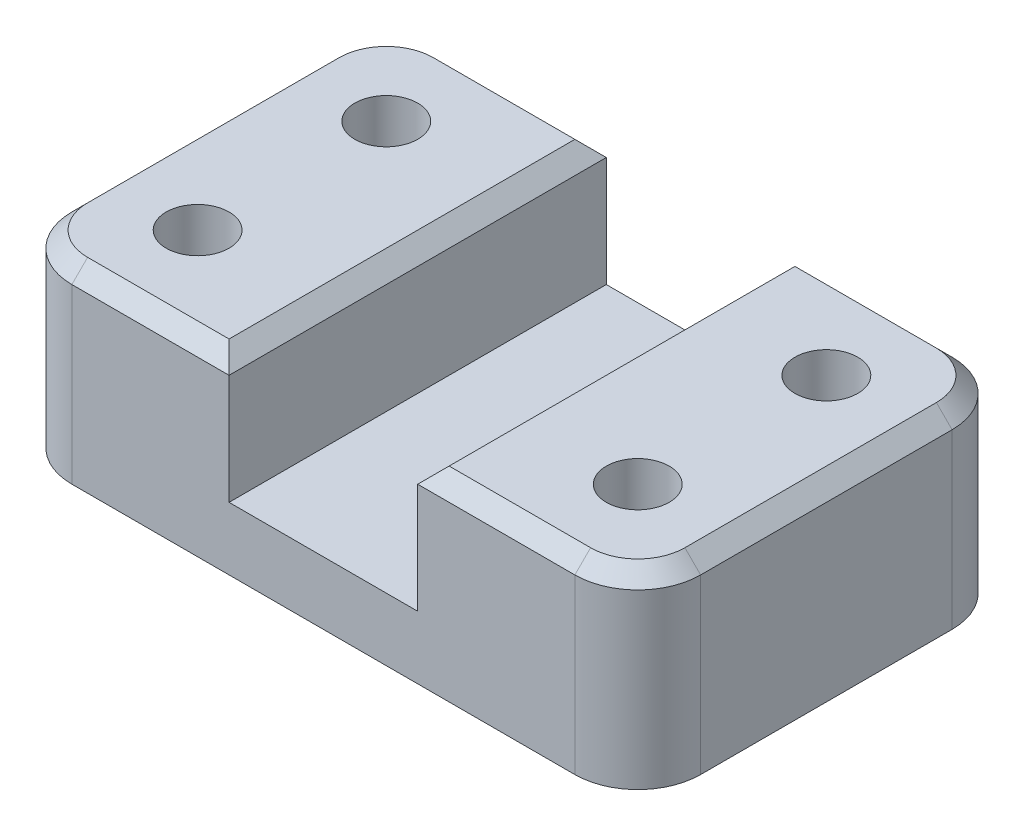
ISO-10303-21;
HEADER;
FILE_DESCRIPTION(('STEP AP214'),'2;1');
FILE_NAME('part.step','',(''),(''),'','','');
FILE_SCHEMA(('AUTOMOTIVE_DESIGN { 1 0 10303 214 1 1 1 1 }'));
ENDSEC;
DATA;
#1=APPLICATION_CONTEXT('core data for automotive mechanical design processes');
#2=APPLICATION_PROTOCOL_DEFINITION('international standard','automotive_design',2000,#1);
#3=PRODUCT_CONTEXT('',#1,'mechanical');
#4=PRODUCT('Part','Part','',(#3));
#5=PRODUCT_RELATED_PRODUCT_CATEGORY('part','',(#4));
#6=PRODUCT_DEFINITION_FORMATION('','',#4);
#7=PRODUCT_DEFINITION_CONTEXT('part definition',#1,'design');
#8=PRODUCT_DEFINITION('design','',#6,#7);
#9=PRODUCT_DEFINITION_SHAPE('','',#8);
#10=(LENGTH_UNIT() NAMED_UNIT(*) SI_UNIT(.MILLI.,.METRE.));
#11=(NAMED_UNIT(*) PLANE_ANGLE_UNIT() SI_UNIT($,.RADIAN.));
#12=(NAMED_UNIT(*) SI_UNIT($,.STERADIAN.) SOLID_ANGLE_UNIT());
#13=UNCERTAINTY_MEASURE_WITH_UNIT(LENGTH_MEASURE(1.E-05),#10,'distance_accuracy_value','');
#14=(GEOMETRIC_REPRESENTATION_CONTEXT(3) GLOBAL_UNCERTAINTY_ASSIGNED_CONTEXT((#13)) GLOBAL_UNIT_ASSIGNED_CONTEXT((#10,
#11,#12)) REPRESENTATION_CONTEXT('',''));
#15=CARTESIAN_POINT('',(0.,0.,0.));
#16=DIRECTION('',(0.,0.,1.));
#17=DIRECTION('',(1.,0.,0.));
#18=AXIS2_PLACEMENT_3D('',#15,#16,#17);
#19=CARTESIAN_POINT('',(0.,1500.,0.));
#20=DIRECTION('',(0.,-1.,0.));
#21=DIRECTION('',(0.,0.,-1.));
#22=AXIS2_PLACEMENT_3D('',#19,#20,#21);
#23=PLANE('',#22);
#24=DIRECTION('',(0.,0.,-1.));
#25=VECTOR('',#24,1.);
#26=CARTESIAN_POINT('',(-874.999999999999,1500.,0.));
#27=LINE('',#26,#25);
#28=CARTESIAN_POINT('',(-874.999999999999,1500.,1375.));
#29=VERTEX_POINT('',#28);
#30=CARTESIAN_POINT('',(-874.999999999999,1500.,-1375.));
#31=VERTEX_POINT('',#30);
#32=EDGE_CURVE('E345',#29,#31,#27,.T.);
#33=ORIENTED_EDGE('',*,*,#32,.T.);
#34=DIRECTION('',(-1.,0.,0.));
#35=VECTOR('',#34,1.);
#36=CARTESIAN_POINT('',(0.,1500.,-1375.));
#37=LINE('',#36,#35);
#38=CARTESIAN_POINT('',(-2000.,1500.,-1375.));
#39=VERTEX_POINT('',#38);
#40=EDGE_CURVE('E357',#31,#39,#37,.T.);
#41=ORIENTED_EDGE('',*,*,#40,.T.);
#42=CARTESIAN_POINT('',(-2000.,1500.,-1000.));
#43=DIRECTION('',(0.,-1.,0.));
#44=DIRECTION('',(0.,0.,-1.));
#45=AXIS2_PLACEMENT_3D('',#42,#43,#44);
#46=CIRCLE('',#45,375.000000000001);
#47=CARTESIAN_POINT('',(-2375.,1500.,-1000.));
#48=VERTEX_POINT('',#47);
#49=EDGE_CURVE('E354',#39,#48,#46,.F.);
#50=ORIENTED_EDGE('',*,*,#49,.T.);
#51=DIRECTION('',(0.,0.,1.));
#52=VECTOR('',#51,1.);
#53=CARTESIAN_POINT('',(-2375.,1500.,0.));
#54=LINE('',#53,#52);
#55=CARTESIAN_POINT('',(-2375.,1500.,1000.));
#56=VERTEX_POINT('',#55);
#57=EDGE_CURVE('E351',#48,#56,#54,.T.);
#58=ORIENTED_EDGE('',*,*,#57,.T.);
#59=CARTESIAN_POINT('',(-2000.,1500.,1000.));
#60=DIRECTION('',(0.,-1.,0.));
#61=DIRECTION('',(0.,0.,-1.));
#62=AXIS2_PLACEMENT_3D('',#59,#60,#61);
#63=CIRCLE('',#62,375.000000000001);
#64=CARTESIAN_POINT('',(-2000.,1500.,1375.));
#65=VERTEX_POINT('',#64);
#66=EDGE_CURVE('E348',#56,#65,#63,.F.);
#67=ORIENTED_EDGE('',*,*,#66,.T.);
#68=DIRECTION('',(1.,0.,0.));
#69=VECTOR('',#68,1.);
#70=CARTESIAN_POINT('',(0.,1500.,1375.));
#71=LINE('',#70,#69);
#72=EDGE_CURVE('E342',#65,#29,#71,.T.);
#73=ORIENTED_EDGE('',*,*,#72,.T.);
#74=EDGE_LOOP('',(#33,#41,#50,#58,#67,#73));
#75=FACE_BOUND('',#74,.T.);
#76=CARTESIAN_POINT('',(-1750.,1500.,750.));
#77=DIRECTION('',(0.,1.,0.));
#78=DIRECTION('',(0.,0.,-1.));
#79=AXIS2_PLACEMENT_3D('',#76,#77,#78);
#80=CIRCLE('',#79,250.);
#81=CARTESIAN_POINT('',(-1750.,1500.,500.));
#82=VERTEX_POINT('',#81);
#83=EDGE_CURVE('E212',#82,#82,#80,.T.);
#84=ORIENTED_EDGE('',*,*,#83,.F.);
#85=EDGE_LOOP('',(#84));
#86=FACE_BOUND('',#85,.T.);
#87=CARTESIAN_POINT('',(-1750.,1500.,-750.));
#88=DIRECTION('',(0.,1.,0.));
#89=DIRECTION('',(0.,0.,1.));
#90=AXIS2_PLACEMENT_3D('',#87,#88,#89);
#91=CIRCLE('',#90,250.);
#92=CARTESIAN_POINT('',(-1750.,1500.,-500.));
#93=VERTEX_POINT('',#92);
#94=EDGE_CURVE('E237',#93,#93,#91,.T.);
#95=ORIENTED_EDGE('',*,*,#94,.F.);
#96=EDGE_LOOP('',(#95));
#97=FACE_BOUND('',#96,.T.);
#98=ADVANCED_FACE('F46',(#75,#86,#97),#23,.F.);
#99=CARTESIAN_POINT('',(2000.,1500.,-1000.));
#100=DIRECTION('',(0.,-1.,0.));
#101=DIRECTION('',(0.,0.,-1.));
#102=AXIS2_PLACEMENT_3D('',#99,#100,#101);
#103=CIRCLE('',#102,375.000000000001);
#104=CARTESIAN_POINT('',(2375.,1500.,-1000.));
#105=VERTEX_POINT('',#104);
#106=CARTESIAN_POINT('',(2000.,1500.,-1375.));
#107=VERTEX_POINT('',#106);
#108=EDGE_CURVE('E310',#105,#107,#103,.F.);
#109=ORIENTED_EDGE('',*,*,#108,.T.);
#110=DIRECTION('',(-1.,0.,0.));
#111=VECTOR('',#110,1.);
#112=CARTESIAN_POINT('',(0.,1500.,-1375.));
#113=LINE('',#112,#111);
#114=CARTESIAN_POINT('',(874.999999999999,1500.,-1375.));
#115=VERTEX_POINT('',#114);
#116=EDGE_CURVE('E313',#107,#115,#113,.T.);
#117=ORIENTED_EDGE('',*,*,#116,.T.);
#118=DIRECTION('',(0.,0.,1.));
#119=VECTOR('',#118,1.);
#120=CARTESIAN_POINT('',(874.999999999999,1500.,0.));
#121=LINE('',#120,#119);
#122=CARTESIAN_POINT('',(874.999999999999,1500.,1375.));
#123=VERTEX_POINT('',#122);
#124=EDGE_CURVE('E301',#115,#123,#121,.T.);
#125=ORIENTED_EDGE('',*,*,#124,.T.);
#126=DIRECTION('',(1.,0.,0.));
#127=VECTOR('',#126,1.);
#128=CARTESIAN_POINT('',(0.,1500.,1375.));
#129=LINE('',#128,#127);
#130=CARTESIAN_POINT('',(2000.,1500.,1375.));
#131=VERTEX_POINT('',#130);
#132=EDGE_CURVE('E298',#123,#131,#129,.T.);
#133=ORIENTED_EDGE('',*,*,#132,.T.);
#134=CARTESIAN_POINT('',(2000.,1500.,1000.));
#135=DIRECTION('',(0.,-1.,0.));
#136=DIRECTION('',(0.,0.,-1.));
#137=AXIS2_PLACEMENT_3D('',#134,#135,#136);
#138=CIRCLE('',#137,375.000000000001);
#139=CARTESIAN_POINT('',(2375.,1500.,1000.));
#140=VERTEX_POINT('',#139);
#141=EDGE_CURVE('E304',#131,#140,#138,.F.);
#142=ORIENTED_EDGE('',*,*,#141,.T.);
#143=DIRECTION('',(0.,0.,-1.));
#144=VECTOR('',#143,1.);
#145=CARTESIAN_POINT('',(2375.,1500.,0.));
#146=LINE('',#145,#144);
#147=EDGE_CURVE('E307',#140,#105,#146,.T.);
#148=ORIENTED_EDGE('',*,*,#147,.T.);
#149=EDGE_LOOP('',(#109,#117,#125,#133,#142,#148));
#150=FACE_BOUND('',#149,.T.);
#151=CARTESIAN_POINT('',(1750.,1500.,-749.999999999995));
#152=DIRECTION('',(0.,1.,0.));
#153=DIRECTION('',(0.,0.,-1.));
#154=AXIS2_PLACEMENT_3D('',#151,#152,#153);
#155=CIRCLE('',#154,250.);
#156=CARTESIAN_POINT('',(1750.,1500.,-999.999999999996));
#157=VERTEX_POINT('',#156);
#158=EDGE_CURVE('E229',#157,#157,#155,.T.);
#159=ORIENTED_EDGE('',*,*,#158,.F.);
#160=EDGE_LOOP('',(#159));
#161=FACE_BOUND('',#160,.T.);
#162=CARTESIAN_POINT('',(1750.,1500.,749.999999999995));
#163=DIRECTION('',(0.,1.,0.));
#164=DIRECTION('',(0.,0.,1.));
#165=AXIS2_PLACEMENT_3D('',#162,#163,#164);
#166=CIRCLE('',#165,250.);
#167=CARTESIAN_POINT('',(1750.,1500.,999.999999999996));
#168=VERTEX_POINT('',#167);
#169=EDGE_CURVE('E221',#168,#168,#166,.T.);
#170=ORIENTED_EDGE('',*,*,#169,.F.);
#171=EDGE_LOOP('',(#170));
#172=FACE_BOUND('',#171,.T.);
#173=ADVANCED_FACE('F472',(#150,#161,#172),#23,.F.);
#174=CARTESIAN_POINT('',(0.,0.,0.));
#175=DIRECTION('',(0.,-1.,0.));
#176=DIRECTION('',(0.,0.,-1.));
#177=AXIS2_PLACEMENT_3D('',#174,#175,#176);
#178=PLANE('',#177);
#179=CARTESIAN_POINT('',(1750.,0.,749.999999999995));
#180=DIRECTION('',(0.,1.,0.));
#181=DIRECTION('',(0.,0.,1.));
#182=AXIS2_PLACEMENT_3D('',#179,#180,#181);
#183=CIRCLE('',#182,250.);
#184=CARTESIAN_POINT('',(1750.,0.,999.999999999996));
#185=VERTEX_POINT('',#184);
#186=EDGE_CURVE('E216',#185,#185,#183,.T.);
#187=ORIENTED_EDGE('',*,*,#186,.T.);
#188=EDGE_LOOP('',(#187));
#189=FACE_BOUND('',#188,.T.);
#190=CARTESIAN_POINT('',(-1750.,0.,-750.));
#191=DIRECTION('',(0.,1.,0.));
#192=DIRECTION('',(0.,0.,1.));
#193=AXIS2_PLACEMENT_3D('',#190,#191,#192);
#194=CIRCLE('',#193,250.);
#195=CARTESIAN_POINT('',(-1750.,0.,-500.));
#196=VERTEX_POINT('',#195);
#197=EDGE_CURVE('E233',#196,#196,#194,.T.);
#198=ORIENTED_EDGE('',*,*,#197,.T.);
#199=EDGE_LOOP('',(#198));
#200=FACE_BOUND('',#199,.T.);
#201=DIRECTION('',(0.,0.,1.));
#202=VECTOR('',#201,1.);
#203=CARTESIAN_POINT('',(-2500.,0.,1500.));
#204=LINE('',#203,#202);
#205=CARTESIAN_POINT('',(-2500.,0.,-1000.));
#206=VERTEX_POINT('',#205);
#207=CARTESIAN_POINT('',(-2500.,0.,1000.));
#208=VERTEX_POINT('',#207);
#209=EDGE_CURVE('E252',#206,#208,#204,.T.);
#210=ORIENTED_EDGE('',*,*,#209,.F.);
#211=CARTESIAN_POINT('',(-2000.,0.,-1000.));
#212=DIRECTION('',(0.,-1.,0.));
#213=DIRECTION('',(0.,0.,-1.));
#214=AXIS2_PLACEMENT_3D('',#211,#212,#213);
#215=CIRCLE('',#214,500.);
#216=CARTESIAN_POINT('',(-2000.,0.,-1500.));
#217=VERTEX_POINT('',#216);
#218=EDGE_CURVE('E275',#206,#217,#215,.T.);
#219=ORIENTED_EDGE('',*,*,#218,.T.);
#220=DIRECTION('',(-1.,0.,0.));
#221=VECTOR('',#220,1.);
#222=CARTESIAN_POINT('',(-2500.,0.,-1500.));
#223=LINE('',#222,#221);
#224=CARTESIAN_POINT('',(2000.,0.,-1500.));
#225=VERTEX_POINT('',#224);
#226=EDGE_CURVE('E248',#225,#217,#223,.T.);
#227=ORIENTED_EDGE('',*,*,#226,.F.);
#228=CARTESIAN_POINT('',(2000.,0.,-1000.));
#229=DIRECTION('',(0.,-1.,0.));
#230=DIRECTION('',(0.,0.,-1.));
#231=AXIS2_PLACEMENT_3D('',#228,#229,#230);
#232=CIRCLE('',#231,500.);
#233=CARTESIAN_POINT('',(2500.,0.,-1000.));
#234=VERTEX_POINT('',#233);
#235=EDGE_CURVE('E269',#225,#234,#232,.T.);
#236=ORIENTED_EDGE('',*,*,#235,.T.);
#237=DIRECTION('',(0.,0.,-1.));
#238=VECTOR('',#237,1.);
#239=CARTESIAN_POINT('',(2500.,0.,1500.));
#240=LINE('',#239,#238);
#241=CARTESIAN_POINT('',(2500.,0.,1000.));
#242=VERTEX_POINT('',#241);
#243=EDGE_CURVE('E241',#242,#234,#240,.T.);
#244=ORIENTED_EDGE('',*,*,#243,.F.);
#245=CARTESIAN_POINT('',(2000.,0.,1000.));
#246=DIRECTION('',(0.,-1.,0.));
#247=DIRECTION('',(0.,0.,-1.));
#248=AXIS2_PLACEMENT_3D('',#245,#246,#247);
#249=CIRCLE('',#248,500.);
#250=CARTESIAN_POINT('',(2000.,0.,1500.));
#251=VERTEX_POINT('',#250);
#252=EDGE_CURVE('E266',#242,#251,#249,.T.);
#253=ORIENTED_EDGE('',*,*,#252,.T.);
#254=DIRECTION('',(1.,0.,0.));
#255=VECTOR('',#254,1.);
#256=CARTESIAN_POINT('',(-2500.,0.,1500.));
#257=LINE('',#256,#255);
#258=CARTESIAN_POINT('',(-2000.,0.,1500.));
#259=VERTEX_POINT('',#258);
#260=EDGE_CURVE('E256',#259,#251,#257,.T.);
#261=ORIENTED_EDGE('',*,*,#260,.F.);
#262=CARTESIAN_POINT('',(-2000.,0.,1000.));
#263=DIRECTION('',(0.,-1.,0.));
#264=DIRECTION('',(0.,0.,-1.));
#265=AXIS2_PLACEMENT_3D('',#262,#263,#264);
#266=CIRCLE('',#265,500.);
#267=EDGE_CURVE('E272',#259,#208,#266,.T.);
#268=ORIENTED_EDGE('',*,*,#267,.T.);
#269=EDGE_LOOP('',(#210,#219,#227,#236,#244,#253,#261,#268));
#270=FACE_BOUND('',#269,.T.);
#271=CARTESIAN_POINT('',(1750.,0.,-749.999999999995));
#272=DIRECTION('',(0.,1.,0.));
#273=DIRECTION('',(0.,0.,-1.));
#274=AXIS2_PLACEMENT_3D('',#271,#272,#273);
#275=CIRCLE('',#274,250.);
#276=CARTESIAN_POINT('',(1750.,0.,-999.999999999996));
#277=VERTEX_POINT('',#276);
#278=EDGE_CURVE('E225',#277,#277,#275,.T.);
#279=ORIENTED_EDGE('',*,*,#278,.T.);
#280=EDGE_LOOP('',(#279));
#281=FACE_BOUND('',#280,.T.);
#282=CARTESIAN_POINT('',(-1750.,0.,750.));
#283=DIRECTION('',(0.,1.,0.));
#284=DIRECTION('',(0.,0.,-1.));
#285=AXIS2_PLACEMENT_3D('',#282,#283,#284);
#286=CIRCLE('',#285,250.);
#287=CARTESIAN_POINT('',(-1750.,0.,500.));
#288=VERTEX_POINT('',#287);
#289=EDGE_CURVE('E217',#288,#288,#286,.T.);
#290=ORIENTED_EDGE('',*,*,#289,.T.);
#291=EDGE_LOOP('',(#290));
#292=FACE_BOUND('',#291,.T.);
#293=ADVANCED_FACE('F451',(#189,#200,#270,#281,#292),#178,.T.);
#294=CARTESIAN_POINT('',(2500.,1500.,1500.));
#295=DIRECTION('',(-1.,0.,0.));
#296=DIRECTION('',(0.,0.,1.));
#297=AXIS2_PLACEMENT_3D('',#294,#295,#296);
#298=PLANE('',#297);
#299=DIRECTION('',(0.,-1.,0.));
#300=VECTOR('',#299,1.);
#301=CARTESIAN_POINT('',(2500.,1500.,-1000.));
#302=LINE('',#301,#300);
#303=CARTESIAN_POINT('',(2500.,1375.,-1000.));
#304=VERTEX_POINT('',#303);
#305=EDGE_CURVE('E294',#234,#304,#302,.F.);
#306=ORIENTED_EDGE('',*,*,#305,.T.);
#307=DIRECTION('',(0.,0.,1.));
#308=VECTOR('',#307,1.);
#309=CARTESIAN_POINT('',(2500.,1375.,1500.));
#310=LINE('',#309,#308);
#311=CARTESIAN_POINT('',(2500.,1375.,1000.));
#312=VERTEX_POINT('',#311);
#313=EDGE_CURVE('E328',#304,#312,#310,.T.);
#314=ORIENTED_EDGE('',*,*,#313,.T.);
#315=DIRECTION('',(0.,-1.,0.));
#316=VECTOR('',#315,1.);
#317=CARTESIAN_POINT('',(2500.,1500.,1000.));
#318=LINE('',#317,#316);
#319=EDGE_CURVE('E291',#312,#242,#318,.T.);
#320=ORIENTED_EDGE('',*,*,#319,.T.);
#321=ORIENTED_EDGE('',*,*,#243,.T.);
#322=EDGE_LOOP('',(#306,#314,#320,#321));
#323=FACE_BOUND('',#322,.T.);
#324=ADVANCED_FACE('F496',(#323),#298,.F.);
#325=CARTESIAN_POINT('',(-2500.,1500.,-1500.));
#326=DIRECTION('',(0.,0.,1.));
#327=DIRECTION('',(1.,0.,0.));
#328=AXIS2_PLACEMENT_3D('',#325,#326,#327);
#329=PLANE('',#328);
#330=DIRECTION('',(0.,1.,0.));
#331=VECTOR('',#330,1.);
#332=CARTESIAN_POINT('',(750.,500.,-1500.));
#333=LINE('',#332,#331);
#334=CARTESIAN_POINT('',(750.,500.,-1500.));
#335=VERTEX_POINT('',#334);
#336=CARTESIAN_POINT('',(750.,1375.,-1500.));
#337=VERTEX_POINT('',#336);
#338=EDGE_CURVE('E182',#335,#337,#333,.T.);
#339=ORIENTED_EDGE('',*,*,#338,.T.);
#340=DIRECTION('',(1.,0.,0.));
#341=VECTOR('',#340,1.);
#342=CARTESIAN_POINT('',(-2500.,1375.,-1500.));
#343=LINE('',#342,#341);
#344=CARTESIAN_POINT('',(2000.,1375.,-1500.));
#345=VERTEX_POINT('',#344);
#346=EDGE_CURVE('E321',#337,#345,#343,.T.);
#347=ORIENTED_EDGE('',*,*,#346,.T.);
#348=DIRECTION('',(0.,-1.,0.));
#349=VECTOR('',#348,1.);
#350=CARTESIAN_POINT('',(2000.,1500.,-1500.));
#351=LINE('',#350,#349);
#352=EDGE_CURVE('E278',#345,#225,#351,.T.);
#353=ORIENTED_EDGE('',*,*,#352,.T.);
#354=ORIENTED_EDGE('',*,*,#226,.T.);
#355=DIRECTION('',(0.,-1.,0.));
#356=VECTOR('',#355,1.);
#357=CARTESIAN_POINT('',(-2000.,1500.,-1500.));
#358=LINE('',#357,#356);
#359=CARTESIAN_POINT('',(-2000.,1375.,-1500.));
#360=VERTEX_POINT('',#359);
#361=EDGE_CURVE('E281',#217,#360,#358,.F.);
#362=ORIENTED_EDGE('',*,*,#361,.T.);
#363=DIRECTION('',(1.,0.,0.));
#364=VECTOR('',#363,1.);
#365=CARTESIAN_POINT('',(-2500.,1375.,-1500.));
#366=LINE('',#365,#364);
#367=CARTESIAN_POINT('',(-750.,1375.,-1500.));
#368=VERTEX_POINT('',#367);
#369=EDGE_CURVE('E317',#360,#368,#366,.T.);
#370=ORIENTED_EDGE('',*,*,#369,.T.);
#371=DIRECTION('',(0.,1.,0.));
#372=VECTOR('',#371,1.);
#373=CARTESIAN_POINT('',(-750.,500.,-1500.));
#374=LINE('',#373,#372);
#375=CARTESIAN_POINT('',(-750.,500.,-1500.));
#376=VERTEX_POINT('',#375);
#377=EDGE_CURVE('E207',#376,#368,#374,.T.);
#378=ORIENTED_EDGE('',*,*,#377,.F.);
#379=DIRECTION('',(-1.,0.,0.));
#380=VECTOR('',#379,1.);
#381=CARTESIAN_POINT('',(750.,500.,-1500.));
#382=LINE('',#381,#380);
#383=EDGE_CURVE('E187',#335,#376,#382,.T.);
#384=ORIENTED_EDGE('',*,*,#383,.F.);
#385=EDGE_LOOP('',(#339,#347,#353,#354,#362,#370,#378,#384));
#386=FACE_BOUND('',#385,.T.);
#387=ADVANCED_FACE('F432',(#386),#329,.F.);
#388=CARTESIAN_POINT('',(-2500.,1500.,1500.));
#389=DIRECTION('',(1.,0.,0.));
#390=DIRECTION('',(0.,0.,-1.));
#391=AXIS2_PLACEMENT_3D('',#388,#389,#390);
#392=PLANE('',#391);
#393=DIRECTION('',(0.,-1.,0.));
#394=VECTOR('',#393,1.);
#395=CARTESIAN_POINT('',(-2500.,1500.,1000.));
#396=LINE('',#395,#394);
#397=CARTESIAN_POINT('',(-2500.,1375.,1000.));
#398=VERTEX_POINT('',#397);
#399=EDGE_CURVE('E260',#208,#398,#396,.F.);
#400=ORIENTED_EDGE('',*,*,#399,.T.);
#401=DIRECTION('',(0.,0.,-1.));
#402=VECTOR('',#401,1.);
#403=CARTESIAN_POINT('',(-2500.,1375.,1500.));
#404=LINE('',#403,#402);
#405=CARTESIAN_POINT('',(-2500.,1375.,-1000.));
#406=VERTEX_POINT('',#405);
#407=EDGE_CURVE('E71',#398,#406,#404,.T.);
#408=ORIENTED_EDGE('',*,*,#407,.T.);
#409=DIRECTION('',(0.,-1.,0.));
#410=VECTOR('',#409,1.);
#411=CARTESIAN_POINT('',(-2500.,1500.,-1000.));
#412=LINE('',#411,#410);
#413=EDGE_CURVE('E263',#406,#206,#412,.T.);
#414=ORIENTED_EDGE('',*,*,#413,.T.);
#415=ORIENTED_EDGE('',*,*,#209,.T.);
#416=EDGE_LOOP('',(#400,#408,#414,#415));
#417=FACE_BOUND('',#416,.T.);
#418=ADVANCED_FACE('F497',(#417),#392,.F.);
#419=CARTESIAN_POINT('',(-2500.,1500.,1500.));
#420=DIRECTION('',(0.,0.,-1.));
#421=DIRECTION('',(-1.,0.,0.));
#422=AXIS2_PLACEMENT_3D('',#419,#420,#421);
#423=PLANE('',#422);
#424=DIRECTION('',(0.,-1.,0.));
#425=VECTOR('',#424,1.);
#426=CARTESIAN_POINT('',(2000.,1500.,1500.));
#427=LINE('',#426,#425);
#428=CARTESIAN_POINT('',(2000.,1375.,1500.));
#429=VERTEX_POINT('',#428);
#430=EDGE_CURVE('E285',#251,#429,#427,.F.);
#431=ORIENTED_EDGE('',*,*,#430,.T.);
#432=DIRECTION('',(-1.,0.,0.));
#433=VECTOR('',#432,1.);
#434=CARTESIAN_POINT('',(-2500.,1375.,1500.));
#435=LINE('',#434,#433);
#436=CARTESIAN_POINT('',(750.,1375.,1500.));
#437=VERTEX_POINT('',#436);
#438=EDGE_CURVE('E201',#429,#437,#435,.T.);
#439=ORIENTED_EDGE('',*,*,#438,.T.);
#440=DIRECTION('',(0.,1.,0.));
#441=VECTOR('',#440,1.);
#442=CARTESIAN_POINT('',(750.,500.,1500.));
#443=LINE('',#442,#441);
#444=CARTESIAN_POINT('',(750.,500.,1500.));
#445=VERTEX_POINT('',#444);
#446=EDGE_CURVE('E179',#445,#437,#443,.T.);
#447=ORIENTED_EDGE('',*,*,#446,.F.);
#448=DIRECTION('',(1.,0.,0.));
#449=VECTOR('',#448,1.);
#450=CARTESIAN_POINT('',(750.,500.,1500.));
#451=LINE('',#450,#449);
#452=CARTESIAN_POINT('',(-750.,500.,1500.));
#453=VERTEX_POINT('',#452);
#454=EDGE_CURVE('E188',#453,#445,#451,.T.);
#455=ORIENTED_EDGE('',*,*,#454,.F.);
#456=DIRECTION('',(0.,1.,0.));
#457=VECTOR('',#456,1.);
#458=CARTESIAN_POINT('',(-750.,500.,1500.));
#459=LINE('',#458,#457);
#460=CARTESIAN_POINT('',(-750.,1375.,1500.));
#461=VERTEX_POINT('',#460);
#462=EDGE_CURVE('E203',#453,#461,#459,.T.);
#463=ORIENTED_EDGE('',*,*,#462,.T.);
#464=DIRECTION('',(-1.,0.,0.));
#465=VECTOR('',#464,1.);
#466=CARTESIAN_POINT('',(-2500.,1375.,1500.));
#467=LINE('',#466,#465);
#468=CARTESIAN_POINT('',(-2000.,1375.,1500.));
#469=VERTEX_POINT('',#468);
#470=EDGE_CURVE('E337',#461,#469,#467,.T.);
#471=ORIENTED_EDGE('',*,*,#470,.T.);
#472=DIRECTION('',(0.,-1.,0.));
#473=VECTOR('',#472,1.);
#474=CARTESIAN_POINT('',(-2000.,1500.,1500.));
#475=LINE('',#474,#473);
#476=EDGE_CURVE('E288',#469,#259,#475,.T.);
#477=ORIENTED_EDGE('',*,*,#476,.T.);
#478=ORIENTED_EDGE('',*,*,#260,.T.);
#479=EDGE_LOOP('',(#431,#439,#447,#455,#463,#471,#477,#478));
#480=FACE_BOUND('',#479,.T.);
#481=ADVANCED_FACE('F199',(#480),#423,.F.);
#482=CARTESIAN_POINT('',(-1750.,1500.,-750.));
#483=DIRECTION('',(0.,-1.,0.));
#484=DIRECTION('',(0.,0.,-1.));
#485=AXIS2_PLACEMENT_3D('',#482,#483,#484);
#486=CYLINDRICAL_SURFACE('',#485,250.);
#487=ORIENTED_EDGE('',*,*,#94,.T.);
#488=EDGE_LOOP('',(#487));
#489=FACE_BOUND('',#488,.T.);
#490=ORIENTED_EDGE('',*,*,#197,.F.);
#491=EDGE_LOOP('',(#490));
#492=FACE_BOUND('',#491,.T.);
#493=ADVANCED_FACE('F504',(#489,#492),#486,.F.);
#494=CARTESIAN_POINT('',(1750.,1500.,-749.999999999995));
#495=DIRECTION('',(0.,-1.,0.));
#496=DIRECTION('',(0.,0.,-1.));
#497=AXIS2_PLACEMENT_3D('',#494,#495,#496);
#498=CYLINDRICAL_SURFACE('',#497,250.);
#499=ORIENTED_EDGE('',*,*,#158,.T.);
#500=EDGE_LOOP('',(#499));
#501=FACE_BOUND('',#500,.T.);
#502=ORIENTED_EDGE('',*,*,#278,.F.);
#503=EDGE_LOOP('',(#502));
#504=FACE_BOUND('',#503,.T.);
#505=ADVANCED_FACE('F528',(#501,#504),#498,.F.);
#506=CARTESIAN_POINT('',(1750.,1500.,749.999999999995));
#507=DIRECTION('',(0.,-1.,0.));
#508=DIRECTION('',(0.,0.,-1.));
#509=AXIS2_PLACEMENT_3D('',#506,#507,#508);
#510=CYLINDRICAL_SURFACE('',#509,250.);
#511=ORIENTED_EDGE('',*,*,#169,.T.);
#512=EDGE_LOOP('',(#511));
#513=FACE_BOUND('',#512,.T.);
#514=ORIENTED_EDGE('',*,*,#186,.F.);
#515=EDGE_LOOP('',(#514));
#516=FACE_BOUND('',#515,.T.);
#517=ADVANCED_FACE('F533',(#513,#516),#510,.F.);
#518=CARTESIAN_POINT('',(-1750.,1500.,750.));
#519=DIRECTION('',(0.,-1.,0.));
#520=DIRECTION('',(0.,0.,-1.));
#521=AXIS2_PLACEMENT_3D('',#518,#519,#520);
#522=CYLINDRICAL_SURFACE('',#521,250.);
#523=ORIENTED_EDGE('',*,*,#83,.T.);
#524=EDGE_LOOP('',(#523));
#525=FACE_BOUND('',#524,.T.);
#526=ORIENTED_EDGE('',*,*,#289,.F.);
#527=EDGE_LOOP('',(#526));
#528=FACE_BOUND('',#527,.T.);
#529=ADVANCED_FACE('F540',(#525,#528),#522,.F.);
#530=CARTESIAN_POINT('',(-750.,500.,1500.));
#531=DIRECTION('',(-1.,0.,0.));
#532=DIRECTION('',(0.,0.,1.));
#533=AXIS2_PLACEMENT_3D('',#530,#531,#532);
#534=PLANE('',#533);
#535=ORIENTED_EDGE('',*,*,#377,.T.);
#536=DIRECTION('',(0.,0.,1.));
#537=VECTOR('',#536,1.);
#538=CARTESIAN_POINT('',(-750.,1375.,1500.));
#539=LINE('',#538,#537);
#540=EDGE_CURVE('E11',#368,#461,#539,.T.);
#541=ORIENTED_EDGE('',*,*,#540,.T.);
#542=ORIENTED_EDGE('',*,*,#462,.F.);
#543=DIRECTION('',(0.,0.,1.));
#544=VECTOR('',#543,1.);
#545=CARTESIAN_POINT('',(-750.,500.,1500.));
#546=LINE('',#545,#544);
#547=EDGE_CURVE('E192',#376,#453,#546,.T.);
#548=ORIENTED_EDGE('',*,*,#547,.F.);
#549=EDGE_LOOP('',(#535,#541,#542,#548));
#550=FACE_BOUND('',#549,.T.);
#551=ADVANCED_FACE('F445',(#550),#534,.F.);
#552=CARTESIAN_POINT('',(750.,500.,1500.));
#553=DIRECTION('',(1.,0.,0.));
#554=DIRECTION('',(0.,0.,-1.));
#555=AXIS2_PLACEMENT_3D('',#552,#553,#554);
#556=PLANE('',#555);
#557=ORIENTED_EDGE('',*,*,#446,.T.);
#558=DIRECTION('',(0.,0.,-1.));
#559=VECTOR('',#558,1.);
#560=CARTESIAN_POINT('',(750.,1375.,1500.));
#561=LINE('',#560,#559);
#562=EDGE_CURVE('E334',#437,#337,#561,.T.);
#563=ORIENTED_EDGE('',*,*,#562,.T.);
#564=ORIENTED_EDGE('',*,*,#338,.F.);
#565=DIRECTION('',(0.,0.,-1.));
#566=VECTOR('',#565,1.);
#567=CARTESIAN_POINT('',(750.,500.,1500.));
#568=LINE('',#567,#566);
#569=EDGE_CURVE('E175',#445,#335,#568,.T.);
#570=ORIENTED_EDGE('',*,*,#569,.F.);
#571=EDGE_LOOP('',(#557,#563,#564,#570));
#572=FACE_BOUND('',#571,.T.);
#573=ADVANCED_FACE('F177',(#572),#556,.F.);
#574=CARTESIAN_POINT('',(0.,500.,0.));
#575=DIRECTION('',(0.,1.,0.));
#576=DIRECTION('',(0.,0.,1.));
#577=AXIS2_PLACEMENT_3D('',#574,#575,#576);
#578=PLANE('',#577);
#579=ORIENTED_EDGE('',*,*,#547,.T.);
#580=ORIENTED_EDGE('',*,*,#454,.T.);
#581=ORIENTED_EDGE('',*,*,#569,.T.);
#582=ORIENTED_EDGE('',*,*,#383,.T.);
#583=EDGE_LOOP('',(#579,#580,#581,#582));
#584=FACE_BOUND('',#583,.T.);
#585=ADVANCED_FACE('F191',(#584),#578,.T.);
#586=CARTESIAN_POINT('',(-2000.,1500.,-1000.));
#587=DIRECTION('',(0.,-1.,0.));
#588=DIRECTION('',(0.,0.,-1.));
#589=AXIS2_PLACEMENT_3D('',#586,#587,#588);
#590=CYLINDRICAL_SURFACE('',#589,500.);
#591=ORIENTED_EDGE('',*,*,#413,.F.);
#592=CARTESIAN_POINT('',(-2000.,1375.,-1000.));
#593=DIRECTION('',(0.,-1.,0.));
#594=DIRECTION('',(0.,0.,-1.));
#595=AXIS2_PLACEMENT_3D('',#592,#593,#594);
#596=CIRCLE('',#595,500.);
#597=EDGE_CURVE('E361',#406,#360,#596,.T.);
#598=ORIENTED_EDGE('',*,*,#597,.T.);
#599=ORIENTED_EDGE('',*,*,#361,.F.);
#600=ORIENTED_EDGE('',*,*,#218,.F.);
#601=EDGE_LOOP('',(#591,#598,#599,#600));
#602=FACE_BOUND('',#601,.T.);
#603=ADVANCED_FACE('F428',(#602),#590,.T.);
#604=CARTESIAN_POINT('',(-2000.,1500.,1000.));
#605=DIRECTION('',(0.,-1.,0.));
#606=DIRECTION('',(0.,0.,-1.));
#607=AXIS2_PLACEMENT_3D('',#604,#605,#606);
#608=CYLINDRICAL_SURFACE('',#607,500.);
#609=ORIENTED_EDGE('',*,*,#476,.F.);
#610=CARTESIAN_POINT('',(-2000.,1375.,1000.));
#611=DIRECTION('',(0.,-1.,0.));
#612=DIRECTION('',(0.,0.,-1.));
#613=AXIS2_PLACEMENT_3D('',#610,#611,#612);
#614=CIRCLE('',#613,500.);
#615=EDGE_CURVE('E57',#469,#398,#614,.T.);
#616=ORIENTED_EDGE('',*,*,#615,.T.);
#617=ORIENTED_EDGE('',*,*,#399,.F.);
#618=ORIENTED_EDGE('',*,*,#267,.F.);
#619=EDGE_LOOP('',(#609,#616,#617,#618));
#620=FACE_BOUND('',#619,.T.);
#621=ADVANCED_FACE('F447',(#620),#608,.T.);
#622=CARTESIAN_POINT('',(2000.,1500.,-1000.));
#623=DIRECTION('',(0.,-1.,0.));
#624=DIRECTION('',(0.,0.,-1.));
#625=AXIS2_PLACEMENT_3D('',#622,#623,#624);
#626=CYLINDRICAL_SURFACE('',#625,500.);
#627=ORIENTED_EDGE('',*,*,#352,.F.);
#628=CARTESIAN_POINT('',(2000.,1375.,-1000.));
#629=DIRECTION('',(0.,-1.,0.));
#630=DIRECTION('',(0.,0.,-1.));
#631=AXIS2_PLACEMENT_3D('',#628,#629,#630);
#632=CIRCLE('',#631,500.);
#633=EDGE_CURVE('E325',#345,#304,#632,.T.);
#634=ORIENTED_EDGE('',*,*,#633,.T.);
#635=ORIENTED_EDGE('',*,*,#305,.F.);
#636=ORIENTED_EDGE('',*,*,#235,.F.);
#637=EDGE_LOOP('',(#627,#634,#635,#636));
#638=FACE_BOUND('',#637,.T.);
#639=ADVANCED_FACE('F493',(#638),#626,.T.);
#640=CARTESIAN_POINT('',(2000.,1500.,1000.));
#641=DIRECTION('',(0.,-1.,0.));
#642=DIRECTION('',(0.,0.,-1.));
#643=AXIS2_PLACEMENT_3D('',#640,#641,#642);
#644=CYLINDRICAL_SURFACE('',#643,500.);
#645=ORIENTED_EDGE('',*,*,#319,.F.);
#646=CARTESIAN_POINT('',(2000.,1375.,1000.));
#647=DIRECTION('',(0.,-1.,0.));
#648=DIRECTION('',(0.,0.,-1.));
#649=AXIS2_PLACEMENT_3D('',#646,#647,#648);
#650=CIRCLE('',#649,500.);
#651=EDGE_CURVE('E331',#312,#429,#650,.T.);
#652=ORIENTED_EDGE('',*,*,#651,.T.);
#653=ORIENTED_EDGE('',*,*,#430,.F.);
#654=ORIENTED_EDGE('',*,*,#252,.F.);
#655=EDGE_LOOP('',(#645,#652,#653,#654));
#656=FACE_BOUND('',#655,.T.);
#657=ADVANCED_FACE('F459',(#656),#644,.T.);
#658=CARTESIAN_POINT('',(2000.,1500.,1000.));
#659=DIRECTION('',(0.,-1.,0.));
#660=DIRECTION('',(0.,0.,-1.));
#661=AXIS2_PLACEMENT_3D('',#658,#659,#660);
#662=CONICAL_SURFACE('',#661,375.000000000001,0.785398163397445);
#663=DIRECTION('',(0.,0.70710678118655,-0.707106781186545));
#664=VECTOR('',#663,1.);
#665=CARTESIAN_POINT('',(2000.,1375.,1500.));
#666=LINE('',#665,#664);
#667=EDGE_CURVE('E382',#429,#131,#666,.T.);
#668=ORIENTED_EDGE('',*,*,#667,.F.);
#669=ORIENTED_EDGE('',*,*,#651,.F.);
#670=DIRECTION('',(0.707106781186545,-0.70710678118655,0.));
#671=VECTOR('',#670,1.);
#672=CARTESIAN_POINT('',(2375.,1500.,1000.));
#673=LINE('',#672,#671);
#674=EDGE_CURVE('E386',#140,#312,#673,.T.);
#675=ORIENTED_EDGE('',*,*,#674,.F.);
#676=ORIENTED_EDGE('',*,*,#141,.F.);
#677=EDGE_LOOP('',(#668,#669,#675,#676));
#678=FACE_BOUND('',#677,.T.);
#679=ADVANCED_FACE('F463',(#678),#662,.T.);
#680=CARTESIAN_POINT('',(2375.,1500.,0.));
#681=DIRECTION('',(-0.70710678118655,-0.707106781186545,0.));
#682=DIRECTION('',(0.,0.,-1.));
#683=AXIS2_PLACEMENT_3D('',#680,#681,#682);
#684=PLANE('',#683);
#685=ORIENTED_EDGE('',*,*,#674,.T.);
#686=ORIENTED_EDGE('',*,*,#313,.F.);
#687=DIRECTION('',(0.707106781186545,-0.70710678118655,0.));
#688=VECTOR('',#687,1.);
#689=CARTESIAN_POINT('',(2375.,1500.,-1000.));
#690=LINE('',#689,#688);
#691=EDGE_CURVE('E378',#105,#304,#690,.T.);
#692=ORIENTED_EDGE('',*,*,#691,.F.);
#693=ORIENTED_EDGE('',*,*,#147,.F.);
#694=EDGE_LOOP('',(#685,#686,#692,#693));
#695=FACE_BOUND('',#694,.T.);
#696=ADVANCED_FACE('F468',(#695),#684,.F.);
#697=CARTESIAN_POINT('',(0.,1500.,1375.));
#698=DIRECTION('',(0.,-0.707106781186545,-0.70710678118655));
#699=DIRECTION('',(1.,0.,0.));
#700=AXIS2_PLACEMENT_3D('',#697,#698,#699);
#701=PLANE('',#700);
#702=ORIENTED_EDGE('',*,*,#667,.T.);
#703=ORIENTED_EDGE('',*,*,#132,.F.);
#704=DIRECTION('',(-0.577350269189624,-0.577350269189629,0.577350269189624));
#705=VECTOR('',#704,1.);
#706=CARTESIAN_POINT('',(583.333333333334,1208.33333333333,1666.66666666667));
#707=LINE('',#706,#705);
#708=EDGE_CURVE('E374',#437,#123,#707,.F.);
#709=ORIENTED_EDGE('',*,*,#708,.F.);
#710=ORIENTED_EDGE('',*,*,#438,.F.);
#711=EDGE_LOOP('',(#702,#703,#709,#710));
#712=FACE_BOUND('',#711,.T.);
#713=ADVANCED_FACE('F477',(#712),#701,.F.);
#714=CARTESIAN_POINT('',(2000.,1500.,-1000.));
#715=DIRECTION('',(0.,-1.,0.));
#716=DIRECTION('',(0.,0.,-1.));
#717=AXIS2_PLACEMENT_3D('',#714,#715,#716);
#718=CONICAL_SURFACE('',#717,375.000000000001,0.785398163397445);
#719=ORIENTED_EDGE('',*,*,#691,.T.);
#720=ORIENTED_EDGE('',*,*,#633,.F.);
#721=DIRECTION('',(0.,-0.70710678118655,-0.707106781186545));
#722=VECTOR('',#721,1.);
#723=CARTESIAN_POINT('',(2000.,1500.,-1375.));
#724=LINE('',#723,#722);
#725=EDGE_CURVE('E371',#107,#345,#724,.T.);
#726=ORIENTED_EDGE('',*,*,#725,.F.);
#727=ORIENTED_EDGE('',*,*,#108,.F.);
#728=EDGE_LOOP('',(#719,#720,#726,#727));
#729=FACE_BOUND('',#728,.T.);
#730=ADVANCED_FACE('F490',(#729),#718,.T.);
#731=CARTESIAN_POINT('',(750.,1375.,1500.));
#732=DIRECTION('',(0.70710678118655,-0.707106781186545,0.));
#733=DIRECTION('',(0.,0.,-1.));
#734=AXIS2_PLACEMENT_3D('',#731,#732,#733);
#735=PLANE('',#734);
#736=ORIENTED_EDGE('',*,*,#708,.T.);
#737=ORIENTED_EDGE('',*,*,#124,.F.);
#738=DIRECTION('',(-0.577350269189624,-0.577350269189629,-0.577350269189624));
#739=VECTOR('',#738,1.);
#740=CARTESIAN_POINT('',(1750.,2375.,-500.000000000004));
#741=LINE('',#740,#739);
#742=EDGE_CURVE('E368',#337,#115,#741,.F.);
#743=ORIENTED_EDGE('',*,*,#742,.F.);
#744=ORIENTED_EDGE('',*,*,#562,.F.);
#745=EDGE_LOOP('',(#736,#737,#743,#744));
#746=FACE_BOUND('',#745,.T.);
#747=ADVANCED_FACE('F482',(#746),#735,.F.);
#748=CARTESIAN_POINT('',(0.,1500.,-1375.));
#749=DIRECTION('',(0.,-0.707106781186545,0.70710678118655));
#750=DIRECTION('',(-1.,0.,0.));
#751=AXIS2_PLACEMENT_3D('',#748,#749,#750);
#752=PLANE('',#751);
#753=ORIENTED_EDGE('',*,*,#725,.T.);
#754=ORIENTED_EDGE('',*,*,#346,.F.);
#755=ORIENTED_EDGE('',*,*,#742,.T.);
#756=ORIENTED_EDGE('',*,*,#116,.F.);
#757=EDGE_LOOP('',(#753,#754,#755,#756));
#758=FACE_BOUND('',#757,.T.);
#759=ADVANCED_FACE('F486',(#758),#752,.F.);
#760=CARTESIAN_POINT('',(-2000.,1500.,1000.));
#761=DIRECTION('',(0.,-1.,0.));
#762=DIRECTION('',(0.,0.,-1.));
#763=AXIS2_PLACEMENT_3D('',#760,#761,#762);
#764=CONICAL_SURFACE('',#763,375.000000000001,0.785398163397445);
#765=DIRECTION('',(0.707106781186545,0.70710678118655,0.));
#766=VECTOR('',#765,1.);
#767=CARTESIAN_POINT('',(-2500.,1375.,1000.));
#768=LINE('',#767,#766);
#769=EDGE_CURVE('E403',#398,#56,#768,.T.);
#770=ORIENTED_EDGE('',*,*,#769,.F.);
#771=ORIENTED_EDGE('',*,*,#615,.F.);
#772=DIRECTION('',(0.,-0.70710678118655,0.707106781186545));
#773=VECTOR('',#772,1.);
#774=CARTESIAN_POINT('',(-2000.,1500.,1375.));
#775=LINE('',#774,#773);
#776=EDGE_CURVE('E51',#65,#469,#775,.T.);
#777=ORIENTED_EDGE('',*,*,#776,.F.);
#778=ORIENTED_EDGE('',*,*,#66,.F.);
#779=EDGE_LOOP('',(#770,#771,#777,#778));
#780=FACE_BOUND('',#779,.T.);
#781=ADVANCED_FACE('F49',(#780),#764,.T.);
#782=CARTESIAN_POINT('',(0.,1500.,1375.));
#783=DIRECTION('',(0.,-0.707106781186545,-0.70710678118655));
#784=DIRECTION('',(1.,0.,0.));
#785=AXIS2_PLACEMENT_3D('',#782,#783,#784);
#786=PLANE('',#785);
#787=ORIENTED_EDGE('',*,*,#776,.T.);
#788=ORIENTED_EDGE('',*,*,#470,.F.);
#789=DIRECTION('',(-0.577350269189624,0.577350269189629,-0.577350269189624));
#790=VECTOR('',#789,1.);
#791=CARTESIAN_POINT('',(-583.333333333334,1208.33333333333,1666.66666666667));
#792=LINE('',#791,#790);
#793=EDGE_CURVE('E400',#29,#461,#792,.F.);
#794=ORIENTED_EDGE('',*,*,#793,.F.);
#795=ORIENTED_EDGE('',*,*,#72,.F.);
#796=EDGE_LOOP('',(#787,#788,#794,#795));
#797=FACE_BOUND('',#796,.T.);
#798=ADVANCED_FACE('F415',(#797),#786,.F.);
#799=CARTESIAN_POINT('',(-2375.,1500.,0.));
#800=DIRECTION('',(0.70710678118655,-0.707106781186545,0.));
#801=DIRECTION('',(0.,0.,1.));
#802=AXIS2_PLACEMENT_3D('',#799,#800,#801);
#803=PLANE('',#802);
#804=ORIENTED_EDGE('',*,*,#769,.T.);
#805=ORIENTED_EDGE('',*,*,#57,.F.);
#806=DIRECTION('',(0.707106781186545,0.70710678118655,0.));
#807=VECTOR('',#806,1.);
#808=CARTESIAN_POINT('',(-2500.,1375.,-1000.));
#809=LINE('',#808,#807);
#810=EDGE_CURVE('E396',#406,#48,#809,.T.);
#811=ORIENTED_EDGE('',*,*,#810,.F.);
#812=ORIENTED_EDGE('',*,*,#407,.F.);
#813=EDGE_LOOP('',(#804,#805,#811,#812));
#814=FACE_BOUND('',#813,.T.);
#815=ADVANCED_FACE('F420',(#814),#803,.F.);
#816=CARTESIAN_POINT('',(-750.,1375.,1500.));
#817=DIRECTION('',(-0.70710678118655,-0.707106781186545,0.));
#818=DIRECTION('',(0.,0.,1.));
#819=AXIS2_PLACEMENT_3D('',#816,#817,#818);
#820=PLANE('',#819);
#821=ORIENTED_EDGE('',*,*,#793,.T.);
#822=ORIENTED_EDGE('',*,*,#540,.F.);
#823=DIRECTION('',(-0.577350269189624,0.577350269189629,0.577350269189624));
#824=VECTOR('',#823,1.);
#825=CARTESIAN_POINT('',(-1749.99999999999,2375.,-500.000000000004));
#826=LINE('',#825,#824);
#827=EDGE_CURVE('E393',#31,#368,#826,.F.);
#828=ORIENTED_EDGE('',*,*,#827,.F.);
#829=ORIENTED_EDGE('',*,*,#32,.F.);
#830=EDGE_LOOP('',(#821,#822,#828,#829));
#831=FACE_BOUND('',#830,.T.);
#832=ADVANCED_FACE('F443',(#831),#820,.F.);
#833=CARTESIAN_POINT('',(-2000.,1500.,-1000.));
#834=DIRECTION('',(0.,-1.,0.));
#835=DIRECTION('',(0.,0.,-1.));
#836=AXIS2_PLACEMENT_3D('',#833,#834,#835);
#837=CONICAL_SURFACE('',#836,375.000000000001,0.785398163397445);
#838=ORIENTED_EDGE('',*,*,#810,.T.);
#839=ORIENTED_EDGE('',*,*,#49,.F.);
#840=DIRECTION('',(0.,0.70710678118655,0.707106781186545));
#841=VECTOR('',#840,1.);
#842=CARTESIAN_POINT('',(-2000.,1375.,-1500.));
#843=LINE('',#842,#841);
#844=EDGE_CURVE('E390',#360,#39,#843,.T.);
#845=ORIENTED_EDGE('',*,*,#844,.F.);
#846=ORIENTED_EDGE('',*,*,#597,.F.);
#847=EDGE_LOOP('',(#838,#839,#845,#846));
#848=FACE_BOUND('',#847,.T.);
#849=ADVANCED_FACE('F425',(#848),#837,.T.);
#850=CARTESIAN_POINT('',(0.,1500.,-1375.));
#851=DIRECTION('',(0.,-0.707106781186545,0.70710678118655));
#852=DIRECTION('',(-1.,0.,0.));
#853=AXIS2_PLACEMENT_3D('',#850,#851,#852);
#854=PLANE('',#853);
#855=ORIENTED_EDGE('',*,*,#827,.T.);
#856=ORIENTED_EDGE('',*,*,#369,.F.);
#857=ORIENTED_EDGE('',*,*,#844,.T.);
#858=ORIENTED_EDGE('',*,*,#40,.F.);
#859=EDGE_LOOP('',(#855,#856,#857,#858));
#860=FACE_BOUND('',#859,.T.);
#861=ADVANCED_FACE('F437',(#860),#854,.F.);
#862=CLOSED_SHELL('',(#98,#173,#293,#324,#387,#418,#481,#493,#505,#517,#529,#551,#573,#585,#603,
#621,#639,#657,#679,#696,#713,#730,#747,#759,#781,#798,#815,#832,#849,#861));
#863=MANIFOLD_SOLID_BREP('B2',#862);
#864=ADVANCED_BREP_SHAPE_REPRESENTATION('',(#18,#863),#14);
#865=SHAPE_DEFINITION_REPRESENTATION(#9,#864);
ENDSEC;
END-ISO-10303-21;
